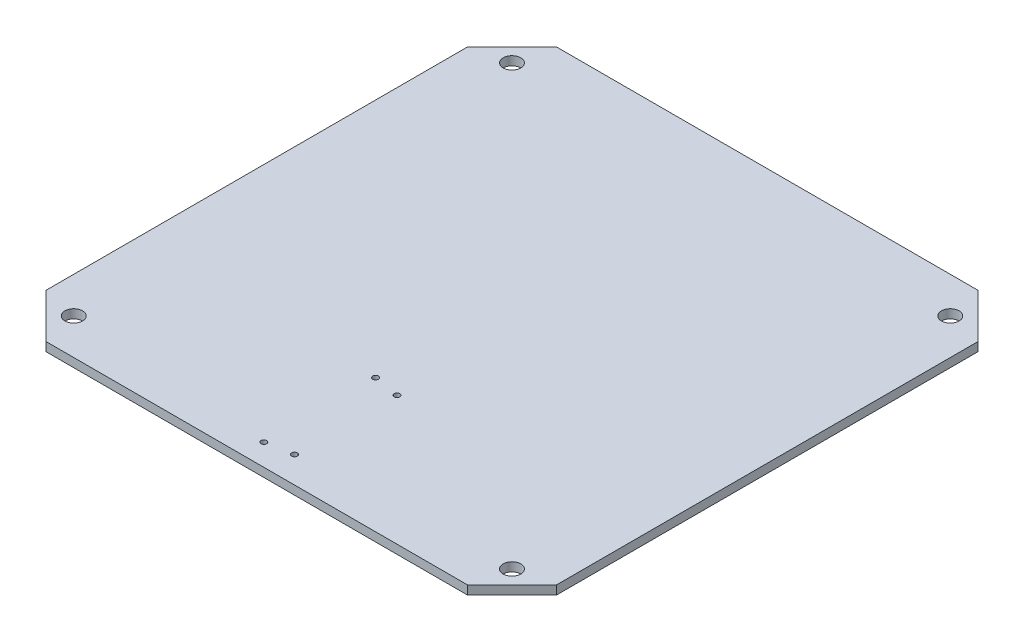
ISO-10303-21;
HEADER;
FILE_DESCRIPTION(('STEP AP214'),'2;1');
FILE_NAME('part.step','',(''),(''),'','','');
FILE_SCHEMA(('AUTOMOTIVE_DESIGN { 1 0 10303 214 1 1 1 1 }'));
ENDSEC;
DATA;
#1=APPLICATION_CONTEXT('core data for automotive mechanical design processes');
#2=APPLICATION_PROTOCOL_DEFINITION('international standard','automotive_design',2000,#1);
#3=PRODUCT_CONTEXT('',#1,'mechanical');
#4=PRODUCT('Part','Part','',(#3));
#5=PRODUCT_RELATED_PRODUCT_CATEGORY('part','',(#4));
#6=PRODUCT_DEFINITION_FORMATION('','',#4);
#7=PRODUCT_DEFINITION_CONTEXT('part definition',#1,'design');
#8=PRODUCT_DEFINITION('design','',#6,#7);
#9=PRODUCT_DEFINITION_SHAPE('','',#8);
#10=(LENGTH_UNIT() NAMED_UNIT(*) SI_UNIT(.MILLI.,.METRE.));
#11=(NAMED_UNIT(*) PLANE_ANGLE_UNIT() SI_UNIT($,.RADIAN.));
#12=(NAMED_UNIT(*) SI_UNIT($,.STERADIAN.) SOLID_ANGLE_UNIT());
#13=UNCERTAINTY_MEASURE_WITH_UNIT(LENGTH_MEASURE(1.E-05),#10,'distance_accuracy_value','');
#14=(GEOMETRIC_REPRESENTATION_CONTEXT(3) GLOBAL_UNCERTAINTY_ASSIGNED_CONTEXT((#13)) GLOBAL_UNIT_ASSIGNED_CONTEXT((#10,
#11,#12)) REPRESENTATION_CONTEXT('',''));
#15=CARTESIAN_POINT('',(0.,0.,0.));
#16=DIRECTION('',(0.,0.,1.));
#17=DIRECTION('',(1.,0.,0.));
#18=AXIS2_PLACEMENT_3D('',#15,#16,#17);
#19=CARTESIAN_POINT('',(-38.,1.59,46.));
#20=DIRECTION('',(-0.707106781186547,0.,0.707106781186547));
#21=DIRECTION('',(0.707106781186548,0.,0.707106781186548));
#22=AXIS2_PLACEMENT_3D('',#19,#20,#21);
#23=PLANE('',#22);
#24=DIRECTION('',(-0.707106781186548,0.,-0.707106781186548));
#25=VECTOR('',#24,1.);
#26=CARTESIAN_POINT('',(-38.,0.,46.));
#27=LINE('',#26,#25);
#28=CARTESIAN_POINT('',(-38.,0.,46.));
#29=VERTEX_POINT('',#28);
#30=CARTESIAN_POINT('',(-46.,0.,38.));
#31=VERTEX_POINT('',#30);
#32=EDGE_CURVE('E142',#29,#31,#27,.T.);
#33=ORIENTED_EDGE('',*,*,#32,.F.);
#34=DIRECTION('',(0.,-1.,0.));
#35=VECTOR('',#34,1.);
#36=CARTESIAN_POINT('',(-38.,1.59,46.));
#37=LINE('',#36,#35);
#38=CARTESIAN_POINT('',(-38.,1.59,46.));
#39=VERTEX_POINT('',#38);
#40=EDGE_CURVE('E11',#39,#29,#37,.T.);
#41=ORIENTED_EDGE('',*,*,#40,.F.);
#42=DIRECTION('',(-0.707106781186548,0.,-0.707106781186548));
#43=VECTOR('',#42,1.);
#44=CARTESIAN_POINT('',(-38.,1.59,46.));
#45=LINE('',#44,#43);
#46=CARTESIAN_POINT('',(-46.,1.59,38.));
#47=VERTEX_POINT('',#46);
#48=EDGE_CURVE('E170',#39,#47,#45,.T.);
#49=ORIENTED_EDGE('',*,*,#48,.T.);
#50=DIRECTION('',(0.,-1.,0.));
#51=VECTOR('',#50,1.);
#52=CARTESIAN_POINT('',(-46.,1.59,38.));
#53=LINE('',#52,#51);
#54=EDGE_CURVE('E44',#47,#31,#53,.T.);
#55=ORIENTED_EDGE('',*,*,#54,.T.);
#56=EDGE_LOOP('',(#33,#41,#49,#55));
#57=FACE_BOUND('',#56,.T.);
#58=ADVANCED_FACE('F41',(#57),#23,.T.);
#59=CARTESIAN_POINT('',(-38.,1.59,46.));
#60=DIRECTION('',(0.,0.,-1.));
#61=DIRECTION('',(-1.,0.,0.));
#62=AXIS2_PLACEMENT_3D('',#59,#60,#61);
#63=PLANE('',#62);
#64=DIRECTION('',(1.,0.,0.));
#65=VECTOR('',#64,1.);
#66=CARTESIAN_POINT('',(-38.,0.,46.));
#67=LINE('',#66,#65);
#68=CARTESIAN_POINT('',(38.,0.,46.));
#69=VERTEX_POINT('',#68);
#70=EDGE_CURVE('E168',#29,#69,#67,.T.);
#71=ORIENTED_EDGE('',*,*,#70,.T.);
#72=DIRECTION('',(0.,-1.,0.));
#73=VECTOR('',#72,1.);
#74=CARTESIAN_POINT('',(38.,1.59,46.));
#75=LINE('',#74,#73);
#76=CARTESIAN_POINT('',(38.,1.59,46.));
#77=VERTEX_POINT('',#76);
#78=EDGE_CURVE('E51',#77,#69,#75,.T.);
#79=ORIENTED_EDGE('',*,*,#78,.F.);
#80=DIRECTION('',(1.,0.,0.));
#81=VECTOR('',#80,1.);
#82=CARTESIAN_POINT('',(-38.,1.59,46.));
#83=LINE('',#82,#81);
#84=EDGE_CURVE('E135',#39,#77,#83,.T.);
#85=ORIENTED_EDGE('',*,*,#84,.F.);
#86=ORIENTED_EDGE('',*,*,#40,.T.);
#87=EDGE_LOOP('',(#71,#79,#85,#86));
#88=FACE_BOUND('',#87,.T.);
#89=ADVANCED_FACE('F189',(#88),#63,.F.);
#90=CARTESIAN_POINT('',(46.,1.59,38.));
#91=DIRECTION('',(0.707106781186548,0.,0.707106781186547));
#92=DIRECTION('',(0.707106781186547,0.,-0.707106781186548));
#93=AXIS2_PLACEMENT_3D('',#90,#91,#92);
#94=PLANE('',#93);
#95=DIRECTION('',(-0.707106781186547,0.,0.707106781186548));
#96=VECTOR('',#95,1.);
#97=CARTESIAN_POINT('',(46.,0.,38.));
#98=LINE('',#97,#96);
#99=CARTESIAN_POINT('',(46.,0.,38.));
#100=VERTEX_POINT('',#99);
#101=EDGE_CURVE('E117',#100,#69,#98,.T.);
#102=ORIENTED_EDGE('',*,*,#101,.F.);
#103=DIRECTION('',(0.,-1.,0.));
#104=VECTOR('',#103,1.);
#105=CARTESIAN_POINT('',(46.,1.59,38.));
#106=LINE('',#105,#104);
#107=CARTESIAN_POINT('',(46.,1.59,38.));
#108=VERTEX_POINT('',#107);
#109=EDGE_CURVE('E111',#108,#100,#106,.T.);
#110=ORIENTED_EDGE('',*,*,#109,.F.);
#111=DIRECTION('',(-0.707106781186547,0.,0.707106781186548));
#112=VECTOR('',#111,1.);
#113=CARTESIAN_POINT('',(46.,1.59,38.));
#114=LINE('',#113,#112);
#115=EDGE_CURVE('E115',#108,#77,#114,.T.);
#116=ORIENTED_EDGE('',*,*,#115,.T.);
#117=ORIENTED_EDGE('',*,*,#78,.T.);
#118=EDGE_LOOP('',(#102,#110,#116,#117));
#119=FACE_BOUND('',#118,.T.);
#120=ADVANCED_FACE('F113',(#119),#94,.T.);
#121=CARTESIAN_POINT('',(46.,1.59,38.));
#122=DIRECTION('',(-1.,0.,0.));
#123=DIRECTION('',(0.,0.,1.));
#124=AXIS2_PLACEMENT_3D('',#121,#122,#123);
#125=PLANE('',#124);
#126=DIRECTION('',(0.,0.,-1.));
#127=VECTOR('',#126,1.);
#128=CARTESIAN_POINT('',(46.,0.,38.));
#129=LINE('',#128,#127);
#130=CARTESIAN_POINT('',(46.,0.,-38.));
#131=VERTEX_POINT('',#130);
#132=EDGE_CURVE('E163',#100,#131,#129,.T.);
#133=ORIENTED_EDGE('',*,*,#132,.T.);
#134=DIRECTION('',(0.,-1.,0.));
#135=VECTOR('',#134,1.);
#136=CARTESIAN_POINT('',(46.,1.59,-38.));
#137=LINE('',#136,#135);
#138=CARTESIAN_POINT('',(46.,1.59,-38.));
#139=VERTEX_POINT('',#138);
#140=EDGE_CURVE('E122',#139,#131,#137,.T.);
#141=ORIENTED_EDGE('',*,*,#140,.F.);
#142=DIRECTION('',(0.,0.,-1.));
#143=VECTOR('',#142,1.);
#144=CARTESIAN_POINT('',(46.,1.59,38.));
#145=LINE('',#144,#143);
#146=EDGE_CURVE('E125',#108,#139,#145,.T.);
#147=ORIENTED_EDGE('',*,*,#146,.F.);
#148=ORIENTED_EDGE('',*,*,#109,.T.);
#149=EDGE_LOOP('',(#133,#141,#147,#148));
#150=FACE_BOUND('',#149,.T.);
#151=ADVANCED_FACE('F126',(#150),#125,.F.);
#152=CARTESIAN_POINT('',(38.,1.59,-46.));
#153=DIRECTION('',(0.707106781186548,0.,-0.707106781186548));
#154=DIRECTION('',(-0.707106781186548,0.,-0.707106781186548));
#155=AXIS2_PLACEMENT_3D('',#152,#153,#154);
#156=PLANE('',#155);
#157=DIRECTION('',(0.707106781186548,0.,0.707106781186548));
#158=VECTOR('',#157,1.);
#159=CARTESIAN_POINT('',(38.,0.,-46.));
#160=LINE('',#159,#158);
#161=CARTESIAN_POINT('',(38.,0.,-46.));
#162=VERTEX_POINT('',#161);
#163=EDGE_CURVE('E159',#162,#131,#160,.T.);
#164=ORIENTED_EDGE('',*,*,#163,.F.);
#165=DIRECTION('',(0.,-1.,0.));
#166=VECTOR('',#165,1.);
#167=CARTESIAN_POINT('',(38.,1.59,-46.));
#168=LINE('',#167,#166);
#169=CARTESIAN_POINT('',(38.,1.59,-46.));
#170=VERTEX_POINT('',#169);
#171=EDGE_CURVE('E176',#170,#162,#168,.T.);
#172=ORIENTED_EDGE('',*,*,#171,.F.);
#173=DIRECTION('',(0.707106781186548,0.,0.707106781186548));
#174=VECTOR('',#173,1.);
#175=CARTESIAN_POINT('',(38.,1.59,-46.));
#176=LINE('',#175,#174);
#177=EDGE_CURVE('E131',#170,#139,#176,.T.);
#178=ORIENTED_EDGE('',*,*,#177,.T.);
#179=ORIENTED_EDGE('',*,*,#140,.T.);
#180=EDGE_LOOP('',(#164,#172,#178,#179));
#181=FACE_BOUND('',#180,.T.);
#182=ADVANCED_FACE('F208',(#181),#156,.T.);
#183=CARTESIAN_POINT('',(-38.,1.59,-46.));
#184=DIRECTION('',(0.,0.,-1.));
#185=DIRECTION('',(-1.,0.,0.));
#186=AXIS2_PLACEMENT_3D('',#183,#184,#185);
#187=PLANE('',#186);
#188=DIRECTION('',(1.,0.,0.));
#189=VECTOR('',#188,1.);
#190=CARTESIAN_POINT('',(-38.,0.,-46.));
#191=LINE('',#190,#189);
#192=CARTESIAN_POINT('',(-38.,0.,-46.));
#193=VERTEX_POINT('',#192);
#194=EDGE_CURVE('E155',#193,#162,#191,.T.);
#195=ORIENTED_EDGE('',*,*,#194,.F.);
#196=DIRECTION('',(0.,-1.,0.));
#197=VECTOR('',#196,1.);
#198=CARTESIAN_POINT('',(-38.,1.59,-46.));
#199=LINE('',#198,#197);
#200=CARTESIAN_POINT('',(-38.,1.59,-46.));
#201=VERTEX_POINT('',#200);
#202=EDGE_CURVE('E179',#201,#193,#199,.T.);
#203=ORIENTED_EDGE('',*,*,#202,.F.);
#204=DIRECTION('',(1.,0.,0.));
#205=VECTOR('',#204,1.);
#206=CARTESIAN_POINT('',(-38.,1.59,-46.));
#207=LINE('',#206,#205);
#208=EDGE_CURVE('E202',#201,#170,#207,.T.);
#209=ORIENTED_EDGE('',*,*,#208,.T.);
#210=ORIENTED_EDGE('',*,*,#171,.T.);
#211=EDGE_LOOP('',(#195,#203,#209,#210));
#212=FACE_BOUND('',#211,.T.);
#213=ADVANCED_FACE('F212',(#212),#187,.T.);
#214=CARTESIAN_POINT('',(-38.,1.59,-46.));
#215=DIRECTION('',(0.707106781186547,0.,0.707106781186547));
#216=DIRECTION('',(0.707106781186548,0.,-0.707106781186548));
#217=AXIS2_PLACEMENT_3D('',#214,#215,#216);
#218=PLANE('',#217);
#219=DIRECTION('',(-0.707106781186548,0.,0.707106781186548));
#220=VECTOR('',#219,1.);
#221=CARTESIAN_POINT('',(-38.,0.,-46.));
#222=LINE('',#221,#220);
#223=CARTESIAN_POINT('',(-46.,0.,-38.));
#224=VERTEX_POINT('',#223);
#225=EDGE_CURVE('E151',#193,#224,#222,.T.);
#226=ORIENTED_EDGE('',*,*,#225,.T.);
#227=DIRECTION('',(0.,-1.,0.));
#228=VECTOR('',#227,1.);
#229=CARTESIAN_POINT('',(-46.,1.59,-38.));
#230=LINE('',#229,#228);
#231=CARTESIAN_POINT('',(-46.,1.59,-38.));
#232=VERTEX_POINT('',#231);
#233=EDGE_CURVE('E181',#232,#224,#230,.T.);
#234=ORIENTED_EDGE('',*,*,#233,.F.);
#235=DIRECTION('',(-0.707106781186548,0.,0.707106781186548));
#236=VECTOR('',#235,1.);
#237=CARTESIAN_POINT('',(-38.,1.59,-46.));
#238=LINE('',#237,#236);
#239=EDGE_CURVE('E194',#201,#232,#238,.T.);
#240=ORIENTED_EDGE('',*,*,#239,.F.);
#241=ORIENTED_EDGE('',*,*,#202,.T.);
#242=EDGE_LOOP('',(#226,#234,#240,#241));
#243=FACE_BOUND('',#242,.T.);
#244=ADVANCED_FACE('F215',(#243),#218,.F.);
#245=CARTESIAN_POINT('',(-46.,1.59,38.));
#246=DIRECTION('',(-1.,0.,0.));
#247=DIRECTION('',(0.,0.,1.));
#248=AXIS2_PLACEMENT_3D('',#245,#246,#247);
#249=PLANE('',#248);
#250=DIRECTION('',(0.,0.,-1.));
#251=VECTOR('',#250,1.);
#252=CARTESIAN_POINT('',(-46.,0.,38.));
#253=LINE('',#252,#251);
#254=EDGE_CURVE('E146',#31,#224,#253,.T.);
#255=ORIENTED_EDGE('',*,*,#254,.F.);
#256=ORIENTED_EDGE('',*,*,#54,.F.);
#257=DIRECTION('',(0.,0.,-1.));
#258=VECTOR('',#257,1.);
#259=CARTESIAN_POINT('',(-46.,1.59,38.));
#260=LINE('',#259,#258);
#261=EDGE_CURVE('E190',#47,#232,#260,.T.);
#262=ORIENTED_EDGE('',*,*,#261,.T.);
#263=ORIENTED_EDGE('',*,*,#233,.T.);
#264=EDGE_LOOP('',(#255,#256,#262,#263));
#265=FACE_BOUND('',#264,.T.);
#266=ADVANCED_FACE('F185',(#265),#249,.T.);
#267=CARTESIAN_POINT('',(0.,1.59,0.));
#268=DIRECTION('',(0.,1.,0.));
#269=DIRECTION('',(0.,0.,1.));
#270=AXIS2_PLACEMENT_3D('',#267,#268,#269);
#271=PLANE('',#270);
#272=CARTESIAN_POINT('',(39.5,1.59,-39.5));
#273=DIRECTION('',(0.,1.,0.));
#274=DIRECTION('',(0.,0.,1.));
#275=AXIS2_PLACEMENT_3D('',#272,#273,#274);
#276=CIRCLE('',#275,1.59);
#277=CARTESIAN_POINT('',(39.5,1.59,-37.91));
#278=VERTEX_POINT('',#277);
#279=EDGE_CURVE('E362',#278,#278,#276,.T.);
#280=ORIENTED_EDGE('',*,*,#279,.F.);
#281=EDGE_LOOP('',(#280));
#282=FACE_BOUND('',#281,.T.);
#283=CARTESIAN_POINT('',(39.5,1.59,39.5));
#284=DIRECTION('',(0.,1.,0.));
#285=DIRECTION('',(0.,0.,1.));
#286=AXIS2_PLACEMENT_3D('',#283,#284,#285);
#287=CIRCLE('',#286,1.59);
#288=CARTESIAN_POINT('',(39.5,1.59,41.09));
#289=VERTEX_POINT('',#288);
#290=EDGE_CURVE('E370',#289,#289,#287,.T.);
#291=ORIENTED_EDGE('',*,*,#290,.F.);
#292=EDGE_LOOP('',(#291));
#293=FACE_BOUND('',#292,.T.);
#294=CARTESIAN_POINT('',(-39.5,1.59,39.5));
#295=DIRECTION('',(0.,1.,0.));
#296=DIRECTION('',(0.,0.,1.));
#297=AXIS2_PLACEMENT_3D('',#294,#295,#296);
#298=CIRCLE('',#297,1.59);
#299=CARTESIAN_POINT('',(-39.5,1.59,41.09));
#300=VERTEX_POINT('',#299);
#301=EDGE_CURVE('E381',#300,#300,#298,.T.);
#302=ORIENTED_EDGE('',*,*,#301,.F.);
#303=EDGE_LOOP('',(#302));
#304=FACE_BOUND('',#303,.T.);
#305=CARTESIAN_POINT('',(-2.67000000000001,1.59,21.93));
#306=DIRECTION('',(0.,1.,0.));
#307=DIRECTION('',(0.,0.,1.));
#308=AXIS2_PLACEMENT_3D('',#305,#306,#307);
#309=CIRCLE('',#308,0.509999999999999);
#310=CARTESIAN_POINT('',(-2.67000000000001,1.59,22.44));
#311=VERTEX_POINT('',#310);
#312=EDGE_CURVE('E389',#311,#311,#309,.T.);
#313=ORIENTED_EDGE('',*,*,#312,.F.);
#314=EDGE_LOOP('',(#313));
#315=FACE_BOUND('',#314,.T.);
#316=CARTESIAN_POINT('',(2.03,1.59,41.24));
#317=DIRECTION('',(0.,1.,0.));
#318=DIRECTION('',(0.,0.,1.));
#319=AXIS2_PLACEMENT_3D('',#316,#317,#318);
#320=CIRCLE('',#319,0.510000000000002);
#321=CARTESIAN_POINT('',(2.03,1.59,41.75));
#322=VERTEX_POINT('',#321);
#323=EDGE_CURVE('E415',#322,#322,#320,.T.);
#324=ORIENTED_EDGE('',*,*,#323,.F.);
#325=EDGE_LOOP('',(#324));
#326=FACE_BOUND('',#325,.T.);
#327=CARTESIAN_POINT('',(-2.67000000000001,1.59,42.07));
#328=DIRECTION('',(0.,1.,0.));
#329=DIRECTION('',(0.,0.,1.));
#330=AXIS2_PLACEMENT_3D('',#327,#328,#329);
#331=CIRCLE('',#330,0.510000000000001);
#332=CARTESIAN_POINT('',(-2.67000000000001,1.59,42.58));
#333=VERTEX_POINT('',#332);
#334=EDGE_CURVE('E420',#333,#333,#331,.T.);
#335=ORIENTED_EDGE('',*,*,#334,.F.);
#336=EDGE_LOOP('',(#335));
#337=FACE_BOUND('',#336,.T.);
#338=CARTESIAN_POINT('',(2.03,1.59,22.75));
#339=DIRECTION('',(0.,1.,0.));
#340=DIRECTION('',(0.,0.,1.));
#341=AXIS2_PLACEMENT_3D('',#338,#339,#340);
#342=CIRCLE('',#341,0.509999999999999);
#343=CARTESIAN_POINT('',(2.03,1.59,23.26));
#344=VERTEX_POINT('',#343);
#345=EDGE_CURVE('E406',#344,#344,#342,.T.);
#346=ORIENTED_EDGE('',*,*,#345,.F.);
#347=EDGE_LOOP('',(#346));
#348=FACE_BOUND('',#347,.T.);
#349=CARTESIAN_POINT('',(-39.5,1.59,-39.5));
#350=DIRECTION('',(0.,1.,0.));
#351=DIRECTION('',(0.,0.,1.));
#352=AXIS2_PLACEMENT_3D('',#349,#350,#351);
#353=CIRCLE('',#352,1.59);
#354=CARTESIAN_POINT('',(-39.5,1.59,-37.91));
#355=VERTEX_POINT('',#354);
#356=EDGE_CURVE('E197',#355,#355,#353,.T.);
#357=ORIENTED_EDGE('',*,*,#356,.F.);
#358=EDGE_LOOP('',(#357));
#359=FACE_BOUND('',#358,.T.);
#360=ORIENTED_EDGE('',*,*,#48,.F.);
#361=ORIENTED_EDGE('',*,*,#84,.T.);
#362=ORIENTED_EDGE('',*,*,#115,.F.);
#363=ORIENTED_EDGE('',*,*,#146,.T.);
#364=ORIENTED_EDGE('',*,*,#177,.F.);
#365=ORIENTED_EDGE('',*,*,#208,.F.);
#366=ORIENTED_EDGE('',*,*,#239,.T.);
#367=ORIENTED_EDGE('',*,*,#261,.F.);
#368=EDGE_LOOP('',(#360,#361,#362,#363,#364,#365,#366,#367));
#369=FACE_BOUND('',#368,.T.);
#370=ADVANCED_FACE('F134',(#282,#293,#304,#315,#326,#337,#348,#359,#369),#271,.T.);
#371=CARTESIAN_POINT('',(0.,0.,0.));
#372=DIRECTION('',(0.,1.,0.));
#373=DIRECTION('',(0.,0.,1.));
#374=AXIS2_PLACEMENT_3D('',#371,#372,#373);
#375=PLANE('',#374);
#376=CARTESIAN_POINT('',(39.5,0.,-39.5));
#377=DIRECTION('',(0.,1.,0.));
#378=DIRECTION('',(0.,0.,1.));
#379=AXIS2_PLACEMENT_3D('',#376,#377,#378);
#380=CIRCLE('',#379,1.59);
#381=CARTESIAN_POINT('',(39.5,0.,-37.91));
#382=VERTEX_POINT('',#381);
#383=EDGE_CURVE('E359',#382,#382,#380,.T.);
#384=ORIENTED_EDGE('',*,*,#383,.T.);
#385=EDGE_LOOP('',(#384));
#386=FACE_BOUND('',#385,.T.);
#387=CARTESIAN_POINT('',(39.5,0.,39.5));
#388=DIRECTION('',(0.,1.,0.));
#389=DIRECTION('',(0.,0.,1.));
#390=AXIS2_PLACEMENT_3D('',#387,#388,#389);
#391=CIRCLE('',#390,1.59);
#392=CARTESIAN_POINT('',(39.5,0.,41.09));
#393=VERTEX_POINT('',#392);
#394=EDGE_CURVE('E364',#393,#393,#391,.T.);
#395=ORIENTED_EDGE('',*,*,#394,.T.);
#396=EDGE_LOOP('',(#395));
#397=FACE_BOUND('',#396,.T.);
#398=CARTESIAN_POINT('',(-39.5,0.,39.5));
#399=DIRECTION('',(0.,1.,0.));
#400=DIRECTION('',(0.,0.,1.));
#401=AXIS2_PLACEMENT_3D('',#398,#399,#400);
#402=CIRCLE('',#401,1.59);
#403=CARTESIAN_POINT('',(-39.5,0.,41.09));
#404=VERTEX_POINT('',#403);
#405=EDGE_CURVE('E377',#404,#404,#402,.T.);
#406=ORIENTED_EDGE('',*,*,#405,.T.);
#407=EDGE_LOOP('',(#406));
#408=FACE_BOUND('',#407,.T.);
#409=CARTESIAN_POINT('',(-2.67000000000001,0.,21.93));
#410=DIRECTION('',(0.,1.,0.));
#411=DIRECTION('',(0.,0.,1.));
#412=AXIS2_PLACEMENT_3D('',#409,#410,#411);
#413=CIRCLE('',#412,0.509999999999999);
#414=CARTESIAN_POINT('',(-2.67000000000001,0.,22.44));
#415=VERTEX_POINT('',#414);
#416=EDGE_CURVE('E385',#415,#415,#413,.T.);
#417=ORIENTED_EDGE('',*,*,#416,.T.);
#418=EDGE_LOOP('',(#417));
#419=FACE_BOUND('',#418,.T.);
#420=CARTESIAN_POINT('',(2.03,0.,41.24));
#421=DIRECTION('',(0.,1.,0.));
#422=DIRECTION('',(0.,0.,1.));
#423=AXIS2_PLACEMENT_3D('',#420,#421,#422);
#424=CIRCLE('',#423,0.510000000000002);
#425=CARTESIAN_POINT('',(2.03,0.,41.75));
#426=VERTEX_POINT('',#425);
#427=EDGE_CURVE('E423',#426,#426,#424,.T.);
#428=ORIENTED_EDGE('',*,*,#427,.T.);
#429=EDGE_LOOP('',(#428));
#430=FACE_BOUND('',#429,.T.);
#431=CARTESIAN_POINT('',(-2.67000000000001,0.,42.07));
#432=DIRECTION('',(0.,1.,0.));
#433=DIRECTION('',(0.,0.,1.));
#434=AXIS2_PLACEMENT_3D('',#431,#432,#433);
#435=CIRCLE('',#434,0.510000000000001);
#436=CARTESIAN_POINT('',(-2.67000000000001,0.,42.58));
#437=VERTEX_POINT('',#436);
#438=EDGE_CURVE('E412',#437,#437,#435,.T.);
#439=ORIENTED_EDGE('',*,*,#438,.T.);
#440=EDGE_LOOP('',(#439));
#441=FACE_BOUND('',#440,.T.);
#442=CARTESIAN_POINT('',(2.03,0.,22.75));
#443=DIRECTION('',(0.,1.,0.));
#444=DIRECTION('',(0.,0.,1.));
#445=AXIS2_PLACEMENT_3D('',#442,#443,#444);
#446=CIRCLE('',#445,0.509999999999999);
#447=CARTESIAN_POINT('',(2.03,0.,23.26));
#448=VERTEX_POINT('',#447);
#449=EDGE_CURVE('E392',#448,#448,#446,.T.);
#450=ORIENTED_EDGE('',*,*,#449,.T.);
#451=EDGE_LOOP('',(#450));
#452=FACE_BOUND('',#451,.T.);
#453=CARTESIAN_POINT('',(-39.5,0.,-39.5));
#454=DIRECTION('',(0.,1.,0.));
#455=DIRECTION('',(0.,0.,1.));
#456=AXIS2_PLACEMENT_3D('',#453,#454,#455);
#457=CIRCLE('',#456,1.59);
#458=CARTESIAN_POINT('',(-39.5,0.,-37.91));
#459=VERTEX_POINT('',#458);
#460=EDGE_CURVE('E147',#459,#459,#457,.T.);
#461=ORIENTED_EDGE('',*,*,#460,.T.);
#462=EDGE_LOOP('',(#461));
#463=FACE_BOUND('',#462,.T.);
#464=ORIENTED_EDGE('',*,*,#32,.T.);
#465=ORIENTED_EDGE('',*,*,#254,.T.);
#466=ORIENTED_EDGE('',*,*,#225,.F.);
#467=ORIENTED_EDGE('',*,*,#194,.T.);
#468=ORIENTED_EDGE('',*,*,#163,.T.);
#469=ORIENTED_EDGE('',*,*,#132,.F.);
#470=ORIENTED_EDGE('',*,*,#101,.T.);
#471=ORIENTED_EDGE('',*,*,#70,.F.);
#472=EDGE_LOOP('',(#464,#465,#466,#467,#468,#469,#470,#471));
#473=FACE_BOUND('',#472,.T.);
#474=ADVANCED_FACE('F188',(#386,#397,#408,#419,#430,#441,#452,#463,#473),#375,.F.);
#475=CARTESIAN_POINT('',(-39.5,0.,-39.5));
#476=DIRECTION('',(0.,1.,0.));
#477=DIRECTION('',(0.,0.,1.));
#478=AXIS2_PLACEMENT_3D('',#475,#476,#477);
#479=CYLINDRICAL_SURFACE('',#478,1.59);
#480=CARTESIAN_POINT('',(-39.5,0.,-37.91));
#481=CARTESIAN_POINT('',(-39.5,0.0165625,-37.91));
#482=CARTESIAN_POINT('',(-39.5,0.033125,-37.91));
#483=CARTESIAN_POINT('',(-39.5,0.06625,-37.91));
#484=CARTESIAN_POINT('',(-39.5,0.0828125,-37.91));
#485=CARTESIAN_POINT('',(-39.5,0.1159375,-37.91));
#486=CARTESIAN_POINT('',(-39.5,0.1325,-37.91));
#487=CARTESIAN_POINT('',(-39.5,0.165625,-37.91));
#488=CARTESIAN_POINT('',(-39.5,0.1821875,-37.91));
#489=CARTESIAN_POINT('',(-39.5,0.2153125,-37.91));
#490=CARTESIAN_POINT('',(-39.5,0.231875,-37.91));
#491=CARTESIAN_POINT('',(-39.5,0.265,-37.91));
#492=CARTESIAN_POINT('',(-39.5,0.2815625,-37.91));
#493=CARTESIAN_POINT('',(-39.5,0.3146875,-37.91));
#494=CARTESIAN_POINT('',(-39.5,0.33125,-37.91));
#495=CARTESIAN_POINT('',(-39.5,0.364375,-37.91));
#496=CARTESIAN_POINT('',(-39.5,0.3809375,-37.91));
#497=CARTESIAN_POINT('',(-39.5,0.4140625,-37.91));
#498=CARTESIAN_POINT('',(-39.5,0.430625,-37.91));
#499=CARTESIAN_POINT('',(-39.5,0.46375,-37.91));
#500=CARTESIAN_POINT('',(-39.5,0.4803125,-37.91));
#501=CARTESIAN_POINT('',(-39.5,0.5134375,-37.91));
#502=CARTESIAN_POINT('',(-39.5,0.53,-37.91));
#503=CARTESIAN_POINT('',(-39.5,0.563125,-37.91));
#504=CARTESIAN_POINT('',(-39.5,0.5796875,-37.91));
#505=CARTESIAN_POINT('',(-39.5,0.6128125,-37.91));
#506=CARTESIAN_POINT('',(-39.5,0.629375,-37.91));
#507=CARTESIAN_POINT('',(-39.5,0.6625,-37.91));
#508=CARTESIAN_POINT('',(-39.5,0.6790625,-37.91));
#509=CARTESIAN_POINT('',(-39.5,0.7121875,-37.91));
#510=CARTESIAN_POINT('',(-39.5,0.72875,-37.91));
#511=CARTESIAN_POINT('',(-39.5,0.761875,-37.91));
#512=CARTESIAN_POINT('',(-39.5,0.7784375,-37.91));
#513=CARTESIAN_POINT('',(-39.5,0.8115625,-37.91));
#514=CARTESIAN_POINT('',(-39.5,0.828125,-37.91));
#515=CARTESIAN_POINT('',(-39.5,0.86125,-37.91));
#516=CARTESIAN_POINT('',(-39.5,0.8778125,-37.91));
#517=CARTESIAN_POINT('',(-39.5,0.9109375,-37.91));
#518=CARTESIAN_POINT('',(-39.5,0.9275,-37.91));
#519=CARTESIAN_POINT('',(-39.5,0.960625,-37.91));
#520=CARTESIAN_POINT('',(-39.5,0.9771875,-37.91));
#521=CARTESIAN_POINT('',(-39.5,1.0103125,-37.91));
#522=CARTESIAN_POINT('',(-39.5,1.026875,-37.91));
#523=CARTESIAN_POINT('',(-39.5,1.06,-37.91));
#524=CARTESIAN_POINT('',(-39.5,1.0765625,-37.91));
#525=CARTESIAN_POINT('',(-39.5,1.1096875,-37.91));
#526=CARTESIAN_POINT('',(-39.5,1.12625,-37.91));
#527=CARTESIAN_POINT('',(-39.5,1.159375,-37.91));
#528=CARTESIAN_POINT('',(-39.5,1.1759375,-37.91));
#529=CARTESIAN_POINT('',(-39.5,1.2090625,-37.91));
#530=CARTESIAN_POINT('',(-39.5,1.225625,-37.91));
#531=CARTESIAN_POINT('',(-39.5,1.25875,-37.91));
#532=CARTESIAN_POINT('',(-39.5,1.2753125,-37.91));
#533=CARTESIAN_POINT('',(-39.5,1.3084375,-37.91));
#534=CARTESIAN_POINT('',(-39.5,1.325,-37.91));
#535=CARTESIAN_POINT('',(-39.5,1.358125,-37.91));
#536=CARTESIAN_POINT('',(-39.5,1.3746875,-37.91));
#537=CARTESIAN_POINT('',(-39.5,1.4078125,-37.91));
#538=CARTESIAN_POINT('',(-39.5,1.424375,-37.91));
#539=CARTESIAN_POINT('',(-39.5,1.4575,-37.91));
#540=CARTESIAN_POINT('',(-39.5,1.4740625,-37.91));
#541=CARTESIAN_POINT('',(-39.5,1.5071875,-37.91));
#542=CARTESIAN_POINT('',(-39.5,1.52375,-37.91));
#543=CARTESIAN_POINT('',(-39.5,1.556875,-37.91));
#544=CARTESIAN_POINT('',(-39.5,1.5734375,-37.91));
#545=CARTESIAN_POINT('',(-39.5,1.59,-37.91));
#546=B_SPLINE_CURVE_WITH_KNOTS('',3,(#480,#481,#482,#483,#484,#485,#486,#487,#488,#489,#490,
#491,#492,#493,#494,#495,#496,#497,#498,#499,#500,#501,#502,#503,#504,#505,#506,#507,#508,#509,
#510,#511,#512,#513,#514,#515,#516,#517,#518,#519,#520,#521,#522,#523,#524,#525,#526,#527,#528,
#529,#530,#531,#532,#533,#534,#535,#536,#537,#538,#539,#540,#541,#542,#543,#544,#545),
.UNSPECIFIED.,.F.,.F.,(4,2,2,2,2,2,2,2,2,2,2,2,2,2,2,2,2,2,2,2,2,2,2,2,2,2,2,2,2,2,2,2,4),(0.,
0.0496875,0.099375,0.1490625,0.19875,0.2484375,0.298125,0.3478125,0.3975,0.4471875,0.496875,
0.5465625,0.59625,0.6459375,0.695625,0.7453125,0.795,0.8446875,0.894375,0.9440625,0.99375,
1.0434375,1.093125,1.1428125,1.1925,1.2421875,1.291875,1.3415625,1.39125,1.4409375,1.490625,
1.5403125,1.59),.UNSPECIFIED.);
#547=EDGE_CURVE('BSEAM273',#459,#355,#546,.T.);
#548=ORIENTED_EDGE('',*,*,#460,.F.);
#549=ORIENTED_EDGE('',*,*,#356,.T.);
#550=ORIENTED_EDGE('',*,*,#547,.T.);
#551=ORIENTED_EDGE('',*,*,#547,.F.);
#552=EDGE_LOOP('',(#548,#550,#549,#551));
#553=FACE_BOUND('',#552,.T.);
#554=ADVANCED_FACE('F273',(#553),#479,.F.);
#555=CARTESIAN_POINT('',(2.03,0.,22.75));
#556=DIRECTION('',(0.,1.,0.));
#557=DIRECTION('',(0.,0.,1.));
#558=AXIS2_PLACEMENT_3D('',#555,#556,#557);
#559=CYLINDRICAL_SURFACE('',#558,0.509999999999999);
#560=ORIENTED_EDGE('',*,*,#449,.F.);
#561=EDGE_LOOP('',(#560));
#562=FACE_BOUND('',#561,.T.);
#563=ORIENTED_EDGE('',*,*,#345,.T.);
#564=EDGE_LOOP('',(#563));
#565=FACE_BOUND('',#564,.T.);
#566=ADVANCED_FACE('F282',(#562,#565),#559,.F.);
#567=CARTESIAN_POINT('',(-2.67000000000001,0.,42.07));
#568=DIRECTION('',(0.,1.,0.));
#569=DIRECTION('',(0.,0.,1.));
#570=AXIS2_PLACEMENT_3D('',#567,#568,#569);
#571=CYLINDRICAL_SURFACE('',#570,0.510000000000001);
#572=ORIENTED_EDGE('',*,*,#438,.F.);
#573=EDGE_LOOP('',(#572));
#574=FACE_BOUND('',#573,.T.);
#575=ORIENTED_EDGE('',*,*,#334,.T.);
#576=EDGE_LOOP('',(#575));
#577=FACE_BOUND('',#576,.T.);
#578=ADVANCED_FACE('F292',(#574,#577),#571,.F.);
#579=CARTESIAN_POINT('',(2.03,0.,41.24));
#580=DIRECTION('',(0.,1.,0.));
#581=DIRECTION('',(0.,0.,1.));
#582=AXIS2_PLACEMENT_3D('',#579,#580,#581);
#583=CYLINDRICAL_SURFACE('',#582,0.510000000000002);
#584=ORIENTED_EDGE('',*,*,#427,.F.);
#585=EDGE_LOOP('',(#584));
#586=FACE_BOUND('',#585,.T.);
#587=ORIENTED_EDGE('',*,*,#323,.T.);
#588=EDGE_LOOP('',(#587));
#589=FACE_BOUND('',#588,.T.);
#590=ADVANCED_FACE('F302',(#586,#589),#583,.F.);
#591=CARTESIAN_POINT('',(-2.67000000000001,0.,21.93));
#592=DIRECTION('',(0.,1.,0.));
#593=DIRECTION('',(0.,0.,1.));
#594=AXIS2_PLACEMENT_3D('',#591,#592,#593);
#595=CYLINDRICAL_SURFACE('',#594,0.509999999999999);
#596=ORIENTED_EDGE('',*,*,#416,.F.);
#597=EDGE_LOOP('',(#596));
#598=FACE_BOUND('',#597,.T.);
#599=ORIENTED_EDGE('',*,*,#312,.T.);
#600=EDGE_LOOP('',(#599));
#601=FACE_BOUND('',#600,.T.);
#602=ADVANCED_FACE('F312',(#598,#601),#595,.F.);
#603=CARTESIAN_POINT('',(-39.5,0.,39.5));
#604=DIRECTION('',(0.,1.,0.));
#605=DIRECTION('',(0.,0.,1.));
#606=AXIS2_PLACEMENT_3D('',#603,#604,#605);
#607=CYLINDRICAL_SURFACE('',#606,1.59);
#608=CARTESIAN_POINT('',(-39.5,0.,41.09));
#609=CARTESIAN_POINT('',(-39.5,0.0165625,41.09));
#610=CARTESIAN_POINT('',(-39.5,0.033125,41.09));
#611=CARTESIAN_POINT('',(-39.5,0.06625,41.09));
#612=CARTESIAN_POINT('',(-39.5,0.0828125,41.09));
#613=CARTESIAN_POINT('',(-39.5,0.1159375,41.09));
#614=CARTESIAN_POINT('',(-39.5,0.1325,41.09));
#615=CARTESIAN_POINT('',(-39.5,0.165625,41.09));
#616=CARTESIAN_POINT('',(-39.5,0.1821875,41.09));
#617=CARTESIAN_POINT('',(-39.5,0.2153125,41.09));
#618=CARTESIAN_POINT('',(-39.5,0.231875,41.09));
#619=CARTESIAN_POINT('',(-39.5,0.265,41.09));
#620=CARTESIAN_POINT('',(-39.5,0.2815625,41.09));
#621=CARTESIAN_POINT('',(-39.5,0.3146875,41.09));
#622=CARTESIAN_POINT('',(-39.5,0.33125,41.09));
#623=CARTESIAN_POINT('',(-39.5,0.364375,41.09));
#624=CARTESIAN_POINT('',(-39.5,0.3809375,41.09));
#625=CARTESIAN_POINT('',(-39.5,0.4140625,41.09));
#626=CARTESIAN_POINT('',(-39.5,0.430625,41.09));
#627=CARTESIAN_POINT('',(-39.5,0.46375,41.09));
#628=CARTESIAN_POINT('',(-39.5,0.4803125,41.09));
#629=CARTESIAN_POINT('',(-39.5,0.5134375,41.09));
#630=CARTESIAN_POINT('',(-39.5,0.53,41.09));
#631=CARTESIAN_POINT('',(-39.5,0.563125,41.09));
#632=CARTESIAN_POINT('',(-39.5,0.5796875,41.09));
#633=CARTESIAN_POINT('',(-39.5,0.6128125,41.09));
#634=CARTESIAN_POINT('',(-39.5,0.629375,41.09));
#635=CARTESIAN_POINT('',(-39.5,0.6625,41.09));
#636=CARTESIAN_POINT('',(-39.5,0.6790625,41.09));
#637=CARTESIAN_POINT('',(-39.5,0.7121875,41.09));
#638=CARTESIAN_POINT('',(-39.5,0.72875,41.09));
#639=CARTESIAN_POINT('',(-39.5,0.761875,41.09));
#640=CARTESIAN_POINT('',(-39.5,0.7784375,41.09));
#641=CARTESIAN_POINT('',(-39.5,0.8115625,41.09));
#642=CARTESIAN_POINT('',(-39.5,0.828125,41.09));
#643=CARTESIAN_POINT('',(-39.5,0.86125,41.09));
#644=CARTESIAN_POINT('',(-39.5,0.8778125,41.09));
#645=CARTESIAN_POINT('',(-39.5,0.9109375,41.09));
#646=CARTESIAN_POINT('',(-39.5,0.9275,41.09));
#647=CARTESIAN_POINT('',(-39.5,0.960625,41.09));
#648=CARTESIAN_POINT('',(-39.5,0.9771875,41.09));
#649=CARTESIAN_POINT('',(-39.5,1.0103125,41.09));
#650=CARTESIAN_POINT('',(-39.5,1.026875,41.09));
#651=CARTESIAN_POINT('',(-39.5,1.06,41.09));
#652=CARTESIAN_POINT('',(-39.5,1.0765625,41.09));
#653=CARTESIAN_POINT('',(-39.5,1.1096875,41.09));
#654=CARTESIAN_POINT('',(-39.5,1.12625,41.09));
#655=CARTESIAN_POINT('',(-39.5,1.159375,41.09));
#656=CARTESIAN_POINT('',(-39.5,1.1759375,41.09));
#657=CARTESIAN_POINT('',(-39.5,1.2090625,41.09));
#658=CARTESIAN_POINT('',(-39.5,1.225625,41.09));
#659=CARTESIAN_POINT('',(-39.5,1.25875,41.09));
#660=CARTESIAN_POINT('',(-39.5,1.2753125,41.09));
#661=CARTESIAN_POINT('',(-39.5,1.3084375,41.09));
#662=CARTESIAN_POINT('',(-39.5,1.325,41.09));
#663=CARTESIAN_POINT('',(-39.5,1.358125,41.09));
#664=CARTESIAN_POINT('',(-39.5,1.3746875,41.09));
#665=CARTESIAN_POINT('',(-39.5,1.4078125,41.09));
#666=CARTESIAN_POINT('',(-39.5,1.424375,41.09));
#667=CARTESIAN_POINT('',(-39.5,1.4575,41.09));
#668=CARTESIAN_POINT('',(-39.5,1.4740625,41.09));
#669=CARTESIAN_POINT('',(-39.5,1.5071875,41.09));
#670=CARTESIAN_POINT('',(-39.5,1.52375,41.09));
#671=CARTESIAN_POINT('',(-39.5,1.556875,41.09));
#672=CARTESIAN_POINT('',(-39.5,1.5734375,41.09));
#673=CARTESIAN_POINT('',(-39.5,1.59,41.09));
#674=B_SPLINE_CURVE_WITH_KNOTS('',3,(#608,#609,#610,#611,#612,#613,#614,#615,#616,#617,#618,
#619,#620,#621,#622,#623,#624,#625,#626,#627,#628,#629,#630,#631,#632,#633,#634,#635,#636,#637,
#638,#639,#640,#641,#642,#643,#644,#645,#646,#647,#648,#649,#650,#651,#652,#653,#654,#655,#656,
#657,#658,#659,#660,#661,#662,#663,#664,#665,#666,#667,#668,#669,#670,#671,#672,#673),
.UNSPECIFIED.,.F.,.F.,(4,2,2,2,2,2,2,2,2,2,2,2,2,2,2,2,2,2,2,2,2,2,2,2,2,2,2,2,2,2,2,2,4),(0.,
0.0496875,0.099375,0.1490625,0.19875,0.2484375,0.298125,0.3478125,0.3975,0.4471875,0.496875,
0.5465625,0.59625,0.6459375,0.695625,0.7453125,0.795,0.8446875,0.894375,0.9440625,0.99375,
1.0434375,1.093125,1.1428125,1.1925,1.2421875,1.291875,1.3415625,1.39125,1.4409375,1.490625,
1.5403125,1.59),.UNSPECIFIED.);
#675=EDGE_CURVE('BSEAM322',#404,#300,#674,.T.);
#676=ORIENTED_EDGE('',*,*,#405,.F.);
#677=ORIENTED_EDGE('',*,*,#301,.T.);
#678=ORIENTED_EDGE('',*,*,#675,.T.);
#679=ORIENTED_EDGE('',*,*,#675,.F.);
#680=EDGE_LOOP('',(#676,#678,#677,#679));
#681=FACE_BOUND('',#680,.T.);
#682=ADVANCED_FACE('F322',(#681),#607,.F.);
#683=CARTESIAN_POINT('',(39.5,0.,39.5));
#684=DIRECTION('',(0.,1.,0.));
#685=DIRECTION('',(0.,0.,1.));
#686=AXIS2_PLACEMENT_3D('',#683,#684,#685);
#687=CYLINDRICAL_SURFACE('',#686,1.59);
#688=CARTESIAN_POINT('',(39.5,0.,41.09));
#689=CARTESIAN_POINT('',(39.5,0.0165625,41.09));
#690=CARTESIAN_POINT('',(39.5,0.033125,41.09));
#691=CARTESIAN_POINT('',(39.5,0.06625,41.09));
#692=CARTESIAN_POINT('',(39.5,0.0828125,41.09));
#693=CARTESIAN_POINT('',(39.5,0.1159375,41.09));
#694=CARTESIAN_POINT('',(39.5,0.1325,41.09));
#695=CARTESIAN_POINT('',(39.5,0.165625,41.09));
#696=CARTESIAN_POINT('',(39.5,0.1821875,41.09));
#697=CARTESIAN_POINT('',(39.5,0.2153125,41.09));
#698=CARTESIAN_POINT('',(39.5,0.231875,41.09));
#699=CARTESIAN_POINT('',(39.5,0.265,41.09));
#700=CARTESIAN_POINT('',(39.5,0.2815625,41.09));
#701=CARTESIAN_POINT('',(39.5,0.3146875,41.09));
#702=CARTESIAN_POINT('',(39.5,0.33125,41.09));
#703=CARTESIAN_POINT('',(39.5,0.364375,41.09));
#704=CARTESIAN_POINT('',(39.5,0.3809375,41.09));
#705=CARTESIAN_POINT('',(39.5,0.4140625,41.09));
#706=CARTESIAN_POINT('',(39.5,0.430625,41.09));
#707=CARTESIAN_POINT('',(39.5,0.46375,41.09));
#708=CARTESIAN_POINT('',(39.5,0.4803125,41.09));
#709=CARTESIAN_POINT('',(39.5,0.5134375,41.09));
#710=CARTESIAN_POINT('',(39.5,0.53,41.09));
#711=CARTESIAN_POINT('',(39.5,0.563125,41.09));
#712=CARTESIAN_POINT('',(39.5,0.5796875,41.09));
#713=CARTESIAN_POINT('',(39.5,0.6128125,41.09));
#714=CARTESIAN_POINT('',(39.5,0.629375,41.09));
#715=CARTESIAN_POINT('',(39.5,0.6625,41.09));
#716=CARTESIAN_POINT('',(39.5,0.6790625,41.09));
#717=CARTESIAN_POINT('',(39.5,0.7121875,41.09));
#718=CARTESIAN_POINT('',(39.5,0.72875,41.09));
#719=CARTESIAN_POINT('',(39.5,0.761875,41.09));
#720=CARTESIAN_POINT('',(39.5,0.7784375,41.09));
#721=CARTESIAN_POINT('',(39.5,0.8115625,41.09));
#722=CARTESIAN_POINT('',(39.5,0.828125,41.09));
#723=CARTESIAN_POINT('',(39.5,0.86125,41.09));
#724=CARTESIAN_POINT('',(39.5,0.8778125,41.09));
#725=CARTESIAN_POINT('',(39.5,0.9109375,41.09));
#726=CARTESIAN_POINT('',(39.5,0.9275,41.09));
#727=CARTESIAN_POINT('',(39.5,0.960625,41.09));
#728=CARTESIAN_POINT('',(39.5,0.9771875,41.09));
#729=CARTESIAN_POINT('',(39.5,1.0103125,41.09));
#730=CARTESIAN_POINT('',(39.5,1.026875,41.09));
#731=CARTESIAN_POINT('',(39.5,1.06,41.09));
#732=CARTESIAN_POINT('',(39.5,1.0765625,41.09));
#733=CARTESIAN_POINT('',(39.5,1.1096875,41.09));
#734=CARTESIAN_POINT('',(39.5,1.12625,41.09));
#735=CARTESIAN_POINT('',(39.5,1.159375,41.09));
#736=CARTESIAN_POINT('',(39.5,1.1759375,41.09));
#737=CARTESIAN_POINT('',(39.5,1.2090625,41.09));
#738=CARTESIAN_POINT('',(39.5,1.225625,41.09));
#739=CARTESIAN_POINT('',(39.5,1.25875,41.09));
#740=CARTESIAN_POINT('',(39.5,1.2753125,41.09));
#741=CARTESIAN_POINT('',(39.5,1.3084375,41.09));
#742=CARTESIAN_POINT('',(39.5,1.325,41.09));
#743=CARTESIAN_POINT('',(39.5,1.358125,41.09));
#744=CARTESIAN_POINT('',(39.5,1.3746875,41.09));
#745=CARTESIAN_POINT('',(39.5,1.4078125,41.09));
#746=CARTESIAN_POINT('',(39.5,1.424375,41.09));
#747=CARTESIAN_POINT('',(39.5,1.4575,41.09));
#748=CARTESIAN_POINT('',(39.5,1.4740625,41.09));
#749=CARTESIAN_POINT('',(39.5,1.5071875,41.09));
#750=CARTESIAN_POINT('',(39.5,1.52375,41.09));
#751=CARTESIAN_POINT('',(39.5,1.556875,41.09));
#752=CARTESIAN_POINT('',(39.5,1.5734375,41.09));
#753=CARTESIAN_POINT('',(39.5,1.59,41.09));
#754=B_SPLINE_CURVE_WITH_KNOTS('',3,(#688,#689,#690,#691,#692,#693,#694,#695,#696,#697,#698,
#699,#700,#701,#702,#703,#704,#705,#706,#707,#708,#709,#710,#711,#712,#713,#714,#715,#716,#717,
#718,#719,#720,#721,#722,#723,#724,#725,#726,#727,#728,#729,#730,#731,#732,#733,#734,#735,#736,
#737,#738,#739,#740,#741,#742,#743,#744,#745,#746,#747,#748,#749,#750,#751,#752,#753),
.UNSPECIFIED.,.F.,.F.,(4,2,2,2,2,2,2,2,2,2,2,2,2,2,2,2,2,2,2,2,2,2,2,2,2,2,2,2,2,2,2,2,4),(0.,
0.0496875,0.099375,0.1490625,0.19875,0.2484375,0.298125,0.3478125,0.3975,0.4471875,0.496875,
0.5465625,0.59625,0.6459375,0.695625,0.7453125,0.795,0.8446875,0.894375,0.9440625,0.99375,
1.0434375,1.093125,1.1428125,1.1925,1.2421875,1.291875,1.3415625,1.39125,1.4409375,1.490625,
1.5403125,1.59),.UNSPECIFIED.);
#755=EDGE_CURVE('BSEAM332',#393,#289,#754,.T.);
#756=ORIENTED_EDGE('',*,*,#394,.F.);
#757=ORIENTED_EDGE('',*,*,#290,.T.);
#758=ORIENTED_EDGE('',*,*,#755,.T.);
#759=ORIENTED_EDGE('',*,*,#755,.F.);
#760=EDGE_LOOP('',(#756,#758,#757,#759));
#761=FACE_BOUND('',#760,.T.);
#762=ADVANCED_FACE('F332',(#761),#687,.F.);
#763=CARTESIAN_POINT('',(39.5,0.,-39.5));
#764=DIRECTION('',(0.,1.,0.));
#765=DIRECTION('',(0.,0.,1.));
#766=AXIS2_PLACEMENT_3D('',#763,#764,#765);
#767=CYLINDRICAL_SURFACE('',#766,1.59);
#768=CARTESIAN_POINT('',(39.5,0.,-37.91));
#769=CARTESIAN_POINT('',(39.5,0.0165625,-37.91));
#770=CARTESIAN_POINT('',(39.5,0.033125,-37.91));
#771=CARTESIAN_POINT('',(39.5,0.06625,-37.91));
#772=CARTESIAN_POINT('',(39.5,0.0828125,-37.91));
#773=CARTESIAN_POINT('',(39.5,0.1159375,-37.91));
#774=CARTESIAN_POINT('',(39.5,0.1325,-37.91));
#775=CARTESIAN_POINT('',(39.5,0.165625,-37.91));
#776=CARTESIAN_POINT('',(39.5,0.1821875,-37.91));
#777=CARTESIAN_POINT('',(39.5,0.2153125,-37.91));
#778=CARTESIAN_POINT('',(39.5,0.231875,-37.91));
#779=CARTESIAN_POINT('',(39.5,0.265,-37.91));
#780=CARTESIAN_POINT('',(39.5,0.2815625,-37.91));
#781=CARTESIAN_POINT('',(39.5,0.3146875,-37.91));
#782=CARTESIAN_POINT('',(39.5,0.33125,-37.91));
#783=CARTESIAN_POINT('',(39.5,0.364375,-37.91));
#784=CARTESIAN_POINT('',(39.5,0.3809375,-37.91));
#785=CARTESIAN_POINT('',(39.5,0.4140625,-37.91));
#786=CARTESIAN_POINT('',(39.5,0.430625,-37.91));
#787=CARTESIAN_POINT('',(39.5,0.46375,-37.91));
#788=CARTESIAN_POINT('',(39.5,0.4803125,-37.91));
#789=CARTESIAN_POINT('',(39.5,0.5134375,-37.91));
#790=CARTESIAN_POINT('',(39.5,0.53,-37.91));
#791=CARTESIAN_POINT('',(39.5,0.563125,-37.91));
#792=CARTESIAN_POINT('',(39.5,0.5796875,-37.91));
#793=CARTESIAN_POINT('',(39.5,0.6128125,-37.91));
#794=CARTESIAN_POINT('',(39.5,0.629375,-37.91));
#795=CARTESIAN_POINT('',(39.5,0.6625,-37.91));
#796=CARTESIAN_POINT('',(39.5,0.6790625,-37.91));
#797=CARTESIAN_POINT('',(39.5,0.7121875,-37.91));
#798=CARTESIAN_POINT('',(39.5,0.72875,-37.91));
#799=CARTESIAN_POINT('',(39.5,0.761875,-37.91));
#800=CARTESIAN_POINT('',(39.5,0.7784375,-37.91));
#801=CARTESIAN_POINT('',(39.5,0.8115625,-37.91));
#802=CARTESIAN_POINT('',(39.5,0.828125,-37.91));
#803=CARTESIAN_POINT('',(39.5,0.86125,-37.91));
#804=CARTESIAN_POINT('',(39.5,0.8778125,-37.91));
#805=CARTESIAN_POINT('',(39.5,0.9109375,-37.91));
#806=CARTESIAN_POINT('',(39.5,0.9275,-37.91));
#807=CARTESIAN_POINT('',(39.5,0.960625,-37.91));
#808=CARTESIAN_POINT('',(39.5,0.9771875,-37.91));
#809=CARTESIAN_POINT('',(39.5,1.0103125,-37.91));
#810=CARTESIAN_POINT('',(39.5,1.026875,-37.91));
#811=CARTESIAN_POINT('',(39.5,1.06,-37.91));
#812=CARTESIAN_POINT('',(39.5,1.0765625,-37.91));
#813=CARTESIAN_POINT('',(39.5,1.1096875,-37.91));
#814=CARTESIAN_POINT('',(39.5,1.12625,-37.91));
#815=CARTESIAN_POINT('',(39.5,1.159375,-37.91));
#816=CARTESIAN_POINT('',(39.5,1.1759375,-37.91));
#817=CARTESIAN_POINT('',(39.5,1.2090625,-37.91));
#818=CARTESIAN_POINT('',(39.5,1.225625,-37.91));
#819=CARTESIAN_POINT('',(39.5,1.25875,-37.91));
#820=CARTESIAN_POINT('',(39.5,1.2753125,-37.91));
#821=CARTESIAN_POINT('',(39.5,1.3084375,-37.91));
#822=CARTESIAN_POINT('',(39.5,1.325,-37.91));
#823=CARTESIAN_POINT('',(39.5,1.358125,-37.91));
#824=CARTESIAN_POINT('',(39.5,1.3746875,-37.91));
#825=CARTESIAN_POINT('',(39.5,1.4078125,-37.91));
#826=CARTESIAN_POINT('',(39.5,1.424375,-37.91));
#827=CARTESIAN_POINT('',(39.5,1.4575,-37.91));
#828=CARTESIAN_POINT('',(39.5,1.4740625,-37.91));
#829=CARTESIAN_POINT('',(39.5,1.5071875,-37.91));
#830=CARTESIAN_POINT('',(39.5,1.52375,-37.91));
#831=CARTESIAN_POINT('',(39.5,1.556875,-37.91));
#832=CARTESIAN_POINT('',(39.5,1.5734375,-37.91));
#833=CARTESIAN_POINT('',(39.5,1.59,-37.91));
#834=B_SPLINE_CURVE_WITH_KNOTS('',3,(#768,#769,#770,#771,#772,#773,#774,#775,#776,#777,#778,
#779,#780,#781,#782,#783,#784,#785,#786,#787,#788,#789,#790,#791,#792,#793,#794,#795,#796,#797,
#798,#799,#800,#801,#802,#803,#804,#805,#806,#807,#808,#809,#810,#811,#812,#813,#814,#815,#816,
#817,#818,#819,#820,#821,#822,#823,#824,#825,#826,#827,#828,#829,#830,#831,#832,#833),
.UNSPECIFIED.,.F.,.F.,(4,2,2,2,2,2,2,2,2,2,2,2,2,2,2,2,2,2,2,2,2,2,2,2,2,2,2,2,2,2,2,2,4),(0.,
0.0496875,0.099375,0.1490625,0.19875,0.2484375,0.298125,0.3478125,0.3975,0.4471875,0.496875,
0.5465625,0.59625,0.6459375,0.695625,0.7453125,0.795,0.8446875,0.894375,0.9440625,0.99375,
1.0434375,1.093125,1.1428125,1.1925,1.2421875,1.291875,1.3415625,1.39125,1.4409375,1.490625,
1.5403125,1.59),.UNSPECIFIED.);
#835=EDGE_CURVE('BSEAM342',#382,#278,#834,.T.);
#836=ORIENTED_EDGE('',*,*,#383,.F.);
#837=ORIENTED_EDGE('',*,*,#279,.T.);
#838=ORIENTED_EDGE('',*,*,#835,.T.);
#839=ORIENTED_EDGE('',*,*,#835,.F.);
#840=EDGE_LOOP('',(#836,#838,#837,#839));
#841=FACE_BOUND('',#840,.T.);
#842=ADVANCED_FACE('F342',(#841),#767,.F.);
#843=CLOSED_SHELL('',(#58,#89,#120,#151,#182,#213,#244,#266,#370,#474,#554,#566,#578,#590,#602,
#682,#762,#842));
#844=MANIFOLD_SOLID_BREP('B2',#843);
#845=ADVANCED_BREP_SHAPE_REPRESENTATION('',(#18,#844),#14);
#846=SHAPE_DEFINITION_REPRESENTATION(#9,#845);
ENDSEC;
END-ISO-10303-21;
